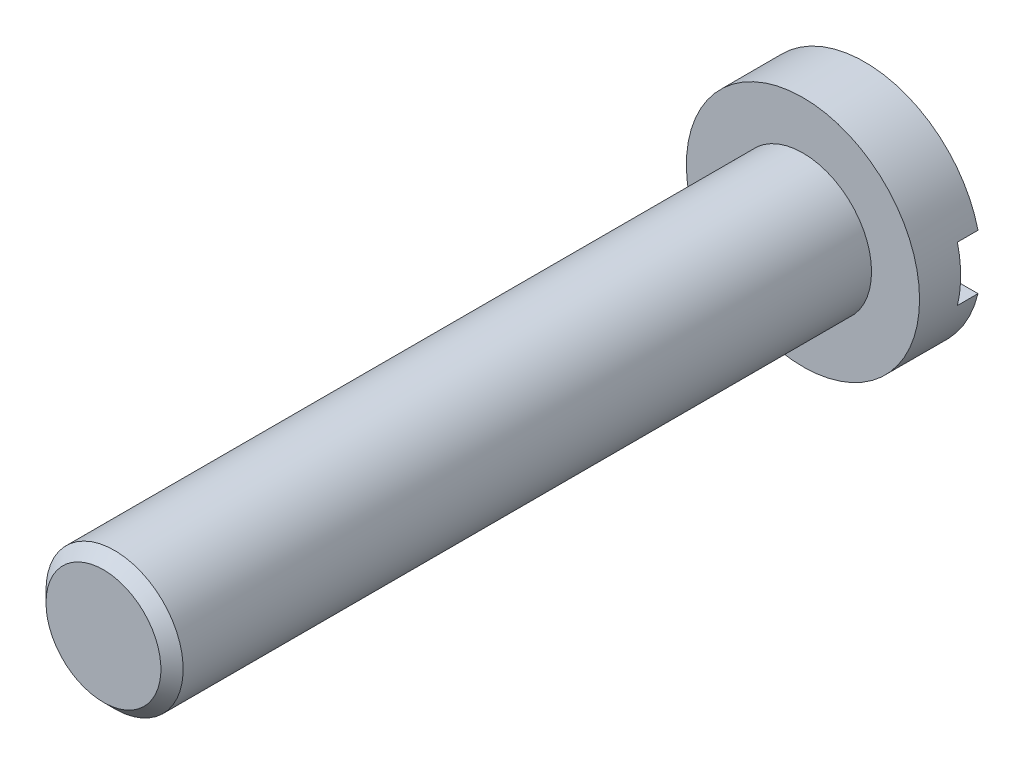
ISO-10303-21;
HEADER;
FILE_DESCRIPTION(('STEP AP214'),'2;1');
FILE_NAME('part.step','',(''),(''),'','','');
FILE_SCHEMA(('AUTOMOTIVE_DESIGN { 1 0 10303 214 1 1 1 1 }'));
ENDSEC;
DATA;
#1=APPLICATION_CONTEXT('core data for automotive mechanical design processes');
#2=APPLICATION_PROTOCOL_DEFINITION('international standard','automotive_design',2000,#1);
#3=PRODUCT_CONTEXT('',#1,'mechanical');
#4=PRODUCT('Part','Part','',(#3));
#5=PRODUCT_RELATED_PRODUCT_CATEGORY('part','',(#4));
#6=PRODUCT_DEFINITION_FORMATION('','',#4);
#7=PRODUCT_DEFINITION_CONTEXT('part definition',#1,'design');
#8=PRODUCT_DEFINITION('design','',#6,#7);
#9=PRODUCT_DEFINITION_SHAPE('','',#8);
#10=(LENGTH_UNIT() NAMED_UNIT(*) SI_UNIT(.MILLI.,.METRE.));
#11=(NAMED_UNIT(*) PLANE_ANGLE_UNIT() SI_UNIT($,.RADIAN.));
#12=(NAMED_UNIT(*) SI_UNIT($,.STERADIAN.) SOLID_ANGLE_UNIT());
#13=UNCERTAINTY_MEASURE_WITH_UNIT(LENGTH_MEASURE(1.E-05),#10,'distance_accuracy_value','');
#14=(GEOMETRIC_REPRESENTATION_CONTEXT(3) GLOBAL_UNCERTAINTY_ASSIGNED_CONTEXT((#13)) GLOBAL_UNIT_ASSIGNED_CONTEXT((#10,
#11,#12)) REPRESENTATION_CONTEXT('',''));
#15=CARTESIAN_POINT('',(0.,0.,0.));
#16=DIRECTION('',(0.,0.,1.));
#17=DIRECTION('',(1.,0.,0.));
#18=AXIS2_PLACEMENT_3D('',#15,#16,#17);
#19=CARTESIAN_POINT('',(0.,0.,4.5));
#20=DIRECTION('',(0.,0.,-1.));
#21=DIRECTION('',(-1.,0.,0.));
#22=AXIS2_PLACEMENT_3D('',#19,#20,#21);
#23=CYLINDRICAL_SURFACE('',#22,8.5);
#24=CARTESIAN_POINT('',(0.,0.,4.5));
#25=DIRECTION('',(0.,0.,1.));
#26=DIRECTION('',(1.,0.,0.));
#27=AXIS2_PLACEMENT_3D('',#24,#25,#26);
#28=CIRCLE('',#27,8.5);
#29=CARTESIAN_POINT('',(8.5,0.,4.5));
#30=VERTEX_POINT('',#29);
#31=EDGE_CURVE('E118',#30,#30,#28,.T.);
#32=ORIENTED_EDGE('',*,*,#31,.F.);
#33=EDGE_LOOP('',(#32));
#34=FACE_BOUND('',#33,.T.);
#35=DIRECTION('',(0.,0.,-1.));
#36=VECTOR('',#35,1.);
#37=CARTESIAN_POINT('',(-8.26135582092915,-2.,4.5));
#38=LINE('',#37,#36);
#39=CARTESIAN_POINT('',(-8.26135582092915,-2.,0.));
#40=VERTEX_POINT('',#39);
#41=CARTESIAN_POINT('',(-8.26135582092915,-2.,1.5));
#42=VERTEX_POINT('',#41);
#43=EDGE_CURVE('E98',#40,#42,#38,.F.);
#44=ORIENTED_EDGE('',*,*,#43,.F.);
#45=CARTESIAN_POINT('',(0.,0.,0.));
#46=DIRECTION('',(0.,0.,1.));
#47=DIRECTION('',(1.,0.,0.));
#48=AXIS2_PLACEMENT_3D('',#45,#46,#47);
#49=CIRCLE('',#48,8.5);
#50=CARTESIAN_POINT('',(8.26135582092915,-2.,0.));
#51=VERTEX_POINT('',#50);
#52=EDGE_CURVE('E117',#40,#51,#49,.T.);
#53=ORIENTED_EDGE('',*,*,#52,.T.);
#54=DIRECTION('',(0.,0.,-1.));
#55=VECTOR('',#54,1.);
#56=CARTESIAN_POINT('',(8.26135582092915,-2.,4.5));
#57=LINE('',#56,#55);
#58=CARTESIAN_POINT('',(8.26135582092915,-2.,1.5));
#59=VERTEX_POINT('',#58);
#60=EDGE_CURVE('E90',#59,#51,#57,.T.);
#61=ORIENTED_EDGE('',*,*,#60,.F.);
#62=CARTESIAN_POINT('',(0.,0.,1.5));
#63=DIRECTION('',(0.,0.,1.));
#64=DIRECTION('',(1.,0.,0.));
#65=AXIS2_PLACEMENT_3D('',#62,#63,#64);
#66=CIRCLE('',#65,8.5);
#67=CARTESIAN_POINT('',(8.26135582092915,2.,1.5));
#68=VERTEX_POINT('',#67);
#69=EDGE_CURVE('E47',#59,#68,#66,.T.);
#70=ORIENTED_EDGE('',*,*,#69,.T.);
#71=DIRECTION('',(0.,0.,-1.));
#72=VECTOR('',#71,1.);
#73=CARTESIAN_POINT('',(8.26135582092915,2.,4.5));
#74=LINE('',#73,#72);
#75=CARTESIAN_POINT('',(8.26135582092915,2.,0.));
#76=VERTEX_POINT('',#75);
#77=EDGE_CURVE('E87',#68,#76,#74,.T.);
#78=ORIENTED_EDGE('',*,*,#77,.T.);
#79=CARTESIAN_POINT('',(-8.26135582092915,2.,0.));
#80=VERTEX_POINT('',#79);
#81=EDGE_CURVE('E121',#76,#80,#49,.T.);
#82=ORIENTED_EDGE('',*,*,#81,.T.);
#83=DIRECTION('',(0.,0.,-1.));
#84=VECTOR('',#83,1.);
#85=CARTESIAN_POINT('',(-8.26135582092915,2.,4.5));
#86=LINE('',#85,#84);
#87=CARTESIAN_POINT('',(-8.26135582092915,2.,1.5));
#88=VERTEX_POINT('',#87);
#89=EDGE_CURVE('E58',#80,#88,#86,.F.);
#90=ORIENTED_EDGE('',*,*,#89,.T.);
#91=EDGE_CURVE('E12',#88,#42,#66,.T.);
#92=ORIENTED_EDGE('',*,*,#91,.T.);
#93=EDGE_LOOP('',(#44,#53,#61,#70,#78,#82,#90,#92));
#94=FACE_BOUND('',#93,.T.);
#95=ADVANCED_FACE('F44',(#34,#94),#23,.T.);
#96=CARTESIAN_POINT('',(0.,0.,0.));
#97=DIRECTION('',(0.,0.,1.));
#98=DIRECTION('',(1.,0.,0.));
#99=AXIS2_PLACEMENT_3D('',#96,#97,#98);
#100=PLANE('',#99);
#101=DIRECTION('',(-1.,0.,0.));
#102=VECTOR('',#101,1.);
#103=CARTESIAN_POINT('',(0.,-2.,0.));
#104=LINE('',#103,#102);
#105=EDGE_CURVE('E66',#51,#40,#104,.T.);
#106=ORIENTED_EDGE('',*,*,#105,.F.);
#107=ORIENTED_EDGE('',*,*,#52,.F.);
#108=EDGE_LOOP('',(#106,#107));
#109=FACE_BOUND('',#108,.T.);
#110=ADVANCED_FACE('F127',(#109),#100,.F.);
#111=CARTESIAN_POINT('',(0.,0.,4.5));
#112=DIRECTION('',(0.,0.,1.));
#113=DIRECTION('',(1.,0.,0.));
#114=AXIS2_PLACEMENT_3D('',#111,#112,#113);
#115=PLANE('',#114);
#116=CARTESIAN_POINT('',(0.,0.,4.5));
#117=DIRECTION('',(0.,0.,1.));
#118=DIRECTION('',(1.,0.,0.));
#119=AXIS2_PLACEMENT_3D('',#116,#117,#118);
#120=CIRCLE('',#119,5.);
#121=CARTESIAN_POINT('',(5.,0.,4.5));
#122=VERTEX_POINT('',#121);
#123=EDGE_CURVE('E114',#122,#122,#120,.F.);
#124=ORIENTED_EDGE('',*,*,#123,.T.);
#125=EDGE_LOOP('',(#124));
#126=FACE_BOUND('',#125,.T.);
#127=ORIENTED_EDGE('',*,*,#31,.T.);
#128=EDGE_LOOP('',(#127));
#129=FACE_BOUND('',#128,.T.);
#130=ADVANCED_FACE('F129',(#126,#129),#115,.T.);
#131=ORIENTED_EDGE('',*,*,#81,.F.);
#132=DIRECTION('',(-1.,0.,0.));
#133=VECTOR('',#132,1.);
#134=CARTESIAN_POINT('',(0.,2.,0.));
#135=LINE('',#134,#133);
#136=EDGE_CURVE('E97',#76,#80,#135,.T.);
#137=ORIENTED_EDGE('',*,*,#136,.T.);
#138=EDGE_LOOP('',(#131,#137));
#139=FACE_BOUND('',#138,.T.);
#140=ADVANCED_FACE('F124',(#139),#100,.F.);
#141=CARTESIAN_POINT('',(0.,0.,55.5));
#142=DIRECTION('',(0.,0.,-1.));
#143=DIRECTION('',(-1.,0.,0.));
#144=AXIS2_PLACEMENT_3D('',#141,#142,#143);
#145=CYLINDRICAL_SURFACE('',#144,5.);
#146=CARTESIAN_POINT('',(0.,0.,54.688));
#147=DIRECTION('',(0.,0.,-1.));
#148=DIRECTION('',(-1.,0.,0.));
#149=AXIS2_PLACEMENT_3D('',#146,#147,#148);
#150=CIRCLE('',#149,5.);
#151=CARTESIAN_POINT('',(-5.,0.,54.688));
#152=VERTEX_POINT('',#151);
#153=EDGE_CURVE('E111',#152,#152,#150,.T.);
#154=ORIENTED_EDGE('',*,*,#153,.T.);
#155=EDGE_LOOP('',(#154));
#156=FACE_BOUND('',#155,.T.);
#157=ORIENTED_EDGE('',*,*,#123,.F.);
#158=EDGE_LOOP('',(#157));
#159=FACE_BOUND('',#158,.T.);
#160=ADVANCED_FACE('F138',(#156,#159),#145,.T.);
#161=CARTESIAN_POINT('',(0.,0.,55.5));
#162=DIRECTION('',(0.,0.,-1.));
#163=DIRECTION('',(-1.,0.,0.));
#164=AXIS2_PLACEMENT_3D('',#161,#162,#163);
#165=CONICAL_SURFACE('',#164,4.188,0.785398163397455);
#166=ORIENTED_EDGE('',*,*,#153,.F.);
#167=EDGE_LOOP('',(#166));
#168=FACE_BOUND('',#167,.T.);
#169=CARTESIAN_POINT('',(0.,0.,55.5));
#170=DIRECTION('',(0.,0.,-1.));
#171=DIRECTION('',(-1.,0.,0.));
#172=AXIS2_PLACEMENT_3D('',#169,#170,#171);
#173=CIRCLE('',#172,4.188);
#174=CARTESIAN_POINT('',(-4.188,0.,55.5));
#175=VERTEX_POINT('',#174);
#176=EDGE_CURVE('E108',#175,#175,#173,.T.);
#177=ORIENTED_EDGE('',*,*,#176,.T.);
#178=EDGE_LOOP('',(#177));
#179=FACE_BOUND('',#178,.T.);
#180=ADVANCED_FACE('F143',(#168,#179),#165,.T.);
#181=CARTESIAN_POINT('',(0.,0.,55.5));
#182=DIRECTION('',(0.,0.,1.));
#183=DIRECTION('',(1.,0.,0.));
#184=AXIS2_PLACEMENT_3D('',#181,#182,#183);
#185=PLANE('',#184);
#186=ORIENTED_EDGE('',*,*,#176,.F.);
#187=EDGE_LOOP('',(#186));
#188=FACE_BOUND('',#187,.T.);
#189=ADVANCED_FACE('F149',(#188),#185,.T.);
#190=CARTESIAN_POINT('',(0.,0.,1.5));
#191=DIRECTION('',(0.,0.,1.));
#192=DIRECTION('',(1.,0.,0.));
#193=AXIS2_PLACEMENT_3D('',#190,#191,#192);
#194=PLANE('',#193);
#195=DIRECTION('',(-1.,0.,0.));
#196=VECTOR('',#195,1.);
#197=CARTESIAN_POINT('',(8.5,2.,1.5));
#198=LINE('',#197,#196);
#199=EDGE_CURVE('E96',#68,#88,#198,.T.);
#200=ORIENTED_EDGE('',*,*,#199,.F.);
#201=ORIENTED_EDGE('',*,*,#69,.F.);
#202=DIRECTION('',(-1.,0.,0.));
#203=VECTOR('',#202,1.);
#204=CARTESIAN_POINT('',(8.5,-2.,1.5));
#205=LINE('',#204,#203);
#206=EDGE_CURVE('E101',#59,#42,#205,.T.);
#207=ORIENTED_EDGE('',*,*,#206,.T.);
#208=ORIENTED_EDGE('',*,*,#91,.F.);
#209=EDGE_LOOP('',(#200,#201,#207,#208));
#210=FACE_BOUND('',#209,.T.);
#211=ADVANCED_FACE('F100',(#210),#194,.F.);
#212=CARTESIAN_POINT('',(8.5,-2.,-1.2E-05));
#213=DIRECTION('',(0.,1.,0.));
#214=DIRECTION('',(0.,0.,1.));
#215=AXIS2_PLACEMENT_3D('',#212,#213,#214);
#216=PLANE('',#215);
#217=ORIENTED_EDGE('',*,*,#60,.T.);
#218=ORIENTED_EDGE('',*,*,#105,.T.);
#219=ORIENTED_EDGE('',*,*,#43,.T.);
#220=ORIENTED_EDGE('',*,*,#206,.F.);
#221=EDGE_LOOP('',(#217,#218,#219,#220));
#222=FACE_BOUND('',#221,.T.);
#223=ADVANCED_FACE('F157',(#222),#216,.T.);
#224=CARTESIAN_POINT('',(8.5,2.,-1.2E-05));
#225=DIRECTION('',(0.,1.,0.));
#226=DIRECTION('',(0.,0.,1.));
#227=AXIS2_PLACEMENT_3D('',#224,#225,#226);
#228=PLANE('',#227);
#229=ORIENTED_EDGE('',*,*,#199,.T.);
#230=ORIENTED_EDGE('',*,*,#89,.F.);
#231=ORIENTED_EDGE('',*,*,#136,.F.);
#232=ORIENTED_EDGE('',*,*,#77,.F.);
#233=EDGE_LOOP('',(#229,#230,#231,#232));
#234=FACE_BOUND('',#233,.T.);
#235=ADVANCED_FACE('F95',(#234),#228,.F.);
#236=CLOSED_SHELL('',(#95,#110,#130,#140,#160,#180,#189,#211,#223,#235));
#237=MANIFOLD_SOLID_BREP('B2',#236);
#238=ADVANCED_BREP_SHAPE_REPRESENTATION('',(#18,#237),#14);
#239=SHAPE_DEFINITION_REPRESENTATION(#9,#238);
ENDSEC;
END-ISO-10303-21;
